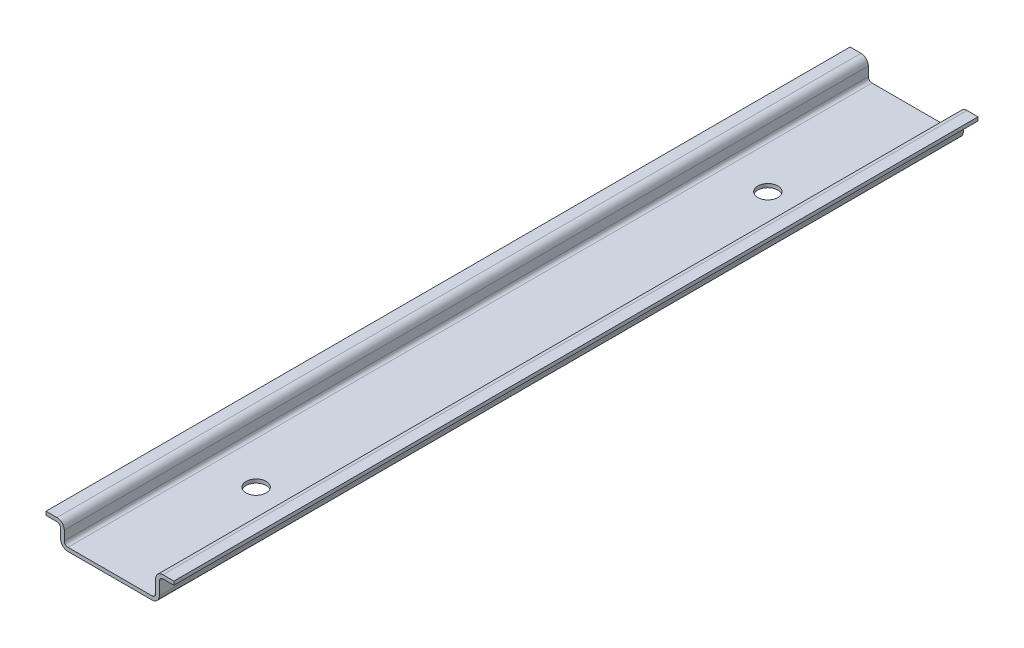
ISO-10303-21;
HEADER;
FILE_DESCRIPTION(('STEP AP214'),'2;1');
FILE_NAME('part.step','',(''),(''),'','','');
FILE_SCHEMA(('AUTOMOTIVE_DESIGN { 1 0 10303 214 1 1 1 1 }'));
ENDSEC;
DATA;
#1=APPLICATION_CONTEXT('core data for automotive mechanical design processes');
#2=APPLICATION_PROTOCOL_DEFINITION('international standard','automotive_design',2000,#1);
#3=PRODUCT_CONTEXT('',#1,'mechanical');
#4=PRODUCT('Part','Part','',(#3));
#5=PRODUCT_RELATED_PRODUCT_CATEGORY('part','',(#4));
#6=PRODUCT_DEFINITION_FORMATION('','',#4);
#7=PRODUCT_DEFINITION_CONTEXT('part definition',#1,'design');
#8=PRODUCT_DEFINITION('design','',#6,#7);
#9=PRODUCT_DEFINITION_SHAPE('','',#8);
#10=(LENGTH_UNIT() NAMED_UNIT(*) SI_UNIT(.MILLI.,.METRE.));
#11=(NAMED_UNIT(*) PLANE_ANGLE_UNIT() SI_UNIT($,.RADIAN.));
#12=(NAMED_UNIT(*) SI_UNIT($,.STERADIAN.) SOLID_ANGLE_UNIT());
#13=UNCERTAINTY_MEASURE_WITH_UNIT(LENGTH_MEASURE(1.E-05),#10,'distance_accuracy_value','');
#14=(GEOMETRIC_REPRESENTATION_CONTEXT(3) GLOBAL_UNCERTAINTY_ASSIGNED_CONTEXT((#13)) GLOBAL_UNIT_ASSIGNED_CONTEXT((#10,
#11,#12)) REPRESENTATION_CONTEXT('',''));
#15=CARTESIAN_POINT('',(0.,0.,0.));
#16=DIRECTION('',(0.,0.,1.));
#17=DIRECTION('',(1.,0.,0.));
#18=AXIS2_PLACEMENT_3D('',#15,#16,#17);
#19=CARTESIAN_POINT('',(-4.,5.54454071771809,220.));
#20=DIRECTION('',(1.,0.,0.));
#21=DIRECTION('',(0.,0.,-1.));
#22=AXIS2_PLACEMENT_3D('',#19,#20,#21);
#23=PLANE('',#22);
#24=DIRECTION('',(0.,-1.,0.));
#25=VECTOR('',#24,1.);
#26=CARTESIAN_POINT('',(-4.,5.54454071771809,0.));
#27=LINE('',#26,#25);
#28=CARTESIAN_POINT('',(-4.,6.54454071771809,0.));
#29=VERTEX_POINT('',#28);
#30=CARTESIAN_POINT('',(-4.,5.54454071771809,0.));
#31=VERTEX_POINT('',#30);
#32=EDGE_CURVE('E201',#29,#31,#27,.T.);
#33=ORIENTED_EDGE('',*,*,#32,.T.);
#34=DIRECTION('',(0.,0.,-1.));
#35=VECTOR('',#34,1.);
#36=CARTESIAN_POINT('',(-4.,5.54454071771809,220.));
#37=LINE('',#36,#35);
#38=CARTESIAN_POINT('',(-4.,5.54454071771809,220.));
#39=VERTEX_POINT('',#38);
#40=EDGE_CURVE('E11',#39,#31,#37,.T.);
#41=ORIENTED_EDGE('',*,*,#40,.F.);
#42=DIRECTION('',(0.,-1.,0.));
#43=VECTOR('',#42,1.);
#44=CARTESIAN_POINT('',(-4.,5.54454071771809,220.));
#45=LINE('',#44,#43);
#46=CARTESIAN_POINT('',(-4.,6.54454071771809,220.));
#47=VERTEX_POINT('',#46);
#48=EDGE_CURVE('E240',#47,#39,#45,.T.);
#49=ORIENTED_EDGE('',*,*,#48,.F.);
#50=DIRECTION('',(0.,0.,-1.));
#51=VECTOR('',#50,1.);
#52=CARTESIAN_POINT('',(-4.,6.54454071771809,220.));
#53=LINE('',#52,#51);
#54=EDGE_CURVE('E197',#47,#29,#53,.T.);
#55=ORIENTED_EDGE('',*,*,#54,.T.);
#56=EDGE_LOOP('',(#33,#41,#49,#55));
#57=FACE_BOUND('',#56,.T.);
#58=ADVANCED_FACE('F33',(#57),#23,.F.);
#59=CARTESIAN_POINT('',(-1.00000000000001,5.54454071771809,220.));
#60=DIRECTION('',(0.,1.,0.));
#61=DIRECTION('',(-1.,0.,0.));
#62=AXIS2_PLACEMENT_3D('',#59,#60,#61);
#63=PLANE('',#62);
#64=DIRECTION('',(1.,0.,0.));
#65=VECTOR('',#64,1.);
#66=CARTESIAN_POINT('',(-1.00000000000001,5.54454071771809,0.));
#67=LINE('',#66,#65);
#68=CARTESIAN_POINT('',(-1.00000000000001,5.54454071771809,0.));
#69=VERTEX_POINT('',#68);
#70=EDGE_CURVE('E204',#31,#69,#67,.T.);
#71=ORIENTED_EDGE('',*,*,#70,.T.);
#72=DIRECTION('',(0.,0.,-1.));
#73=VECTOR('',#72,1.);
#74=CARTESIAN_POINT('',(-1.00000000000001,5.54454071771809,220.));
#75=LINE('',#74,#73);
#76=CARTESIAN_POINT('',(-1.00000000000001,5.54454071771809,220.));
#77=VERTEX_POINT('',#76);
#78=EDGE_CURVE('E41',#77,#69,#75,.T.);
#79=ORIENTED_EDGE('',*,*,#78,.F.);
#80=DIRECTION('',(1.,0.,0.));
#81=VECTOR('',#80,1.);
#82=CARTESIAN_POINT('',(-1.00000000000001,5.54454071771809,220.));
#83=LINE('',#82,#81);
#84=EDGE_CURVE('E128',#39,#77,#83,.T.);
#85=ORIENTED_EDGE('',*,*,#84,.F.);
#86=ORIENTED_EDGE('',*,*,#40,.T.);
#87=EDGE_LOOP('',(#71,#79,#85,#86));
#88=FACE_BOUND('',#87,.T.);
#89=ADVANCED_FACE('F358',(#88),#63,.F.);
#90=CARTESIAN_POINT('',(-1.,4.54454071771809,220.));
#91=DIRECTION('',(0.,0.,-1.));
#92=DIRECTION('',(-1.,0.,0.));
#93=AXIS2_PLACEMENT_3D('',#90,#91,#92);
#94=CYLINDRICAL_SURFACE('',#93,1.);
#95=CARTESIAN_POINT('',(-1.,4.54454071771809,0.));
#96=DIRECTION('',(0.,0.,-1.));
#97=DIRECTION('',(1.,0.,0.));
#98=AXIS2_PLACEMENT_3D('',#95,#96,#97);
#99=CIRCLE('',#98,1.);
#100=CARTESIAN_POINT('',(0.,4.54454071771808,0.));
#101=VERTEX_POINT('',#100);
#102=EDGE_CURVE('E207',#69,#101,#99,.T.);
#103=ORIENTED_EDGE('',*,*,#102,.T.);
#104=DIRECTION('',(0.,0.,-1.));
#105=VECTOR('',#104,1.);
#106=CARTESIAN_POINT('',(0.,4.54454071771808,220.));
#107=LINE('',#106,#105);
#108=CARTESIAN_POINT('',(0.,4.54454071771808,220.));
#109=VERTEX_POINT('',#108);
#110=EDGE_CURVE('E283',#109,#101,#107,.T.);
#111=ORIENTED_EDGE('',*,*,#110,.F.);
#112=CARTESIAN_POINT('',(-1.,4.54454071771809,220.));
#113=DIRECTION('',(0.,0.,-1.));
#114=DIRECTION('',(1.,0.,0.));
#115=AXIS2_PLACEMENT_3D('',#112,#113,#114);
#116=CIRCLE('',#115,1.);
#117=EDGE_CURVE('E291',#77,#109,#116,.T.);
#118=ORIENTED_EDGE('',*,*,#117,.F.);
#119=ORIENTED_EDGE('',*,*,#78,.T.);
#120=EDGE_LOOP('',(#103,#111,#118,#119));
#121=FACE_BOUND('',#120,.T.);
#122=ADVANCED_FACE('F289',(#121),#94,.F.);
#123=CARTESIAN_POINT('',(0.,2.00000000000001,220.));
#124=DIRECTION('',(1.,0.,0.));
#125=DIRECTION('',(0.,0.,-1.));
#126=AXIS2_PLACEMENT_3D('',#123,#124,#125);
#127=PLANE('',#126);
#128=DIRECTION('',(0.,-1.,0.));
#129=VECTOR('',#128,1.);
#130=CARTESIAN_POINT('',(0.,2.00000000000001,0.));
#131=LINE('',#130,#129);
#132=CARTESIAN_POINT('',(0.,2.00000000000001,0.));
#133=VERTEX_POINT('',#132);
#134=EDGE_CURVE('E209',#101,#133,#131,.T.);
#135=ORIENTED_EDGE('',*,*,#134,.T.);
#136=DIRECTION('',(0.,0.,-1.));
#137=VECTOR('',#136,1.);
#138=CARTESIAN_POINT('',(0.,2.00000000000001,220.));
#139=LINE('',#138,#137);
#140=CARTESIAN_POINT('',(0.,2.00000000000001,220.));
#141=VERTEX_POINT('',#140);
#142=EDGE_CURVE('E280',#141,#133,#139,.T.);
#143=ORIENTED_EDGE('',*,*,#142,.F.);
#144=DIRECTION('',(0.,-1.,0.));
#145=VECTOR('',#144,1.);
#146=CARTESIAN_POINT('',(0.,2.00000000000001,220.));
#147=LINE('',#146,#145);
#148=EDGE_CURVE('E309',#109,#141,#147,.T.);
#149=ORIENTED_EDGE('',*,*,#148,.F.);
#150=ORIENTED_EDGE('',*,*,#110,.T.);
#151=EDGE_LOOP('',(#135,#143,#149,#150));
#152=FACE_BOUND('',#151,.T.);
#153=ADVANCED_FACE('F300',(#152),#127,.F.);
#154=CARTESIAN_POINT('',(2.,2.,220.));
#155=DIRECTION('',(0.,0.,-1.));
#156=DIRECTION('',(-1.,0.,0.));
#157=AXIS2_PLACEMENT_3D('',#154,#155,#156);
#158=CYLINDRICAL_SURFACE('',#157,2.);
#159=CARTESIAN_POINT('',(2.,2.,0.));
#160=DIRECTION('',(0.,0.,1.));
#161=DIRECTION('',(-1.,0.,0.));
#162=AXIS2_PLACEMENT_3D('',#159,#160,#161);
#163=CIRCLE('',#162,2.);
#164=CARTESIAN_POINT('',(2.00000000000001,0.,0.));
#165=VERTEX_POINT('',#164);
#166=EDGE_CURVE('E211',#133,#165,#163,.T.);
#167=ORIENTED_EDGE('',*,*,#166,.T.);
#168=DIRECTION('',(0.,0.,-1.));
#169=VECTOR('',#168,1.);
#170=CARTESIAN_POINT('',(2.00000000000001,0.,220.));
#171=LINE('',#170,#169);
#172=CARTESIAN_POINT('',(2.00000000000001,0.,220.));
#173=VERTEX_POINT('',#172);
#174=EDGE_CURVE('E277',#173,#165,#171,.T.);
#175=ORIENTED_EDGE('',*,*,#174,.F.);
#176=CARTESIAN_POINT('',(2.,2.,220.));
#177=DIRECTION('',(0.,0.,1.));
#178=DIRECTION('',(-1.,0.,0.));
#179=AXIS2_PLACEMENT_3D('',#176,#177,#178);
#180=CIRCLE('',#179,2.);
#181=EDGE_CURVE('E306',#141,#173,#180,.T.);
#182=ORIENTED_EDGE('',*,*,#181,.F.);
#183=ORIENTED_EDGE('',*,*,#142,.T.);
#184=EDGE_LOOP('',(#167,#175,#182,#183));
#185=FACE_BOUND('',#184,.T.);
#186=ADVANCED_FACE('F304',(#185),#158,.T.);
#187=CARTESIAN_POINT('',(2.00000000000001,0.,220.));
#188=DIRECTION('',(0.,1.,0.));
#189=DIRECTION('',(0.,0.,1.));
#190=AXIS2_PLACEMENT_3D('',#187,#188,#189);
#191=PLANE('',#190);
#192=CARTESIAN_POINT('',(13.5,0.,180.));
#193=DIRECTION('',(0.,1.,0.));
#194=DIRECTION('',(0.,0.,1.));
#195=AXIS2_PLACEMENT_3D('',#192,#193,#194);
#196=CIRCLE('',#195,2.75);
#197=CARTESIAN_POINT('',(13.5,0.,182.75));
#198=VERTEX_POINT('',#197);
#199=EDGE_CURVE('E485',#198,#198,#196,.T.);
#200=ORIENTED_EDGE('',*,*,#199,.T.);
#201=EDGE_LOOP('',(#200));
#202=FACE_BOUND('',#201,.T.);
#203=CARTESIAN_POINT('',(13.5,0.,40.));
#204=DIRECTION('',(0.,1.,0.));
#205=DIRECTION('',(0.,0.,1.));
#206=AXIS2_PLACEMENT_3D('',#203,#204,#205);
#207=CIRCLE('',#206,2.75);
#208=CARTESIAN_POINT('',(13.5,0.,42.75));
#209=VERTEX_POINT('',#208);
#210=EDGE_CURVE('E205',#209,#209,#207,.T.);
#211=ORIENTED_EDGE('',*,*,#210,.T.);
#212=EDGE_LOOP('',(#211));
#213=FACE_BOUND('',#212,.T.);
#214=DIRECTION('',(1.,0.,0.));
#215=VECTOR('',#214,1.);
#216=CARTESIAN_POINT('',(2.00000000000001,0.,0.));
#217=LINE('',#216,#215);
#218=CARTESIAN_POINT('',(25.,0.,0.));
#219=VERTEX_POINT('',#218);
#220=EDGE_CURVE('E213',#165,#219,#217,.T.);
#221=ORIENTED_EDGE('',*,*,#220,.T.);
#222=DIRECTION('',(0.,0.,-1.));
#223=VECTOR('',#222,1.);
#224=CARTESIAN_POINT('',(25.,0.,220.));
#225=LINE('',#224,#223);
#226=CARTESIAN_POINT('',(25.,0.,220.));
#227=VERTEX_POINT('',#226);
#228=EDGE_CURVE('E274',#227,#219,#225,.T.);
#229=ORIENTED_EDGE('',*,*,#228,.F.);
#230=DIRECTION('',(1.,0.,0.));
#231=VECTOR('',#230,1.);
#232=CARTESIAN_POINT('',(2.00000000000001,0.,220.));
#233=LINE('',#232,#231);
#234=EDGE_CURVE('E308',#173,#227,#233,.T.);
#235=ORIENTED_EDGE('',*,*,#234,.F.);
#236=ORIENTED_EDGE('',*,*,#174,.T.);
#237=EDGE_LOOP('',(#221,#229,#235,#236));
#238=FACE_BOUND('',#237,.T.);
#239=ADVANCED_FACE('F371',(#202,#213,#238),#191,.F.);
#240=CARTESIAN_POINT('',(25.,2.,220.));
#241=DIRECTION('',(0.,0.,-1.));
#242=DIRECTION('',(-1.,0.,0.));
#243=AXIS2_PLACEMENT_3D('',#240,#241,#242);
#244=CYLINDRICAL_SURFACE('',#243,2.);
#245=CARTESIAN_POINT('',(25.,2.,0.));
#246=DIRECTION('',(0.,0.,1.));
#247=DIRECTION('',(1.,0.,0.));
#248=AXIS2_PLACEMENT_3D('',#245,#246,#247);
#249=CIRCLE('',#248,2.);
#250=CARTESIAN_POINT('',(27.,2.,0.));
#251=VERTEX_POINT('',#250);
#252=EDGE_CURVE('E215',#219,#251,#249,.T.);
#253=ORIENTED_EDGE('',*,*,#252,.T.);
#254=DIRECTION('',(0.,0.,-1.));
#255=VECTOR('',#254,1.);
#256=CARTESIAN_POINT('',(27.,2.,220.));
#257=LINE('',#256,#255);
#258=CARTESIAN_POINT('',(27.,2.,220.));
#259=VERTEX_POINT('',#258);
#260=EDGE_CURVE('E271',#259,#251,#257,.T.);
#261=ORIENTED_EDGE('',*,*,#260,.F.);
#262=CARTESIAN_POINT('',(25.,2.,220.));
#263=DIRECTION('',(0.,0.,1.));
#264=DIRECTION('',(1.,0.,0.));
#265=AXIS2_PLACEMENT_3D('',#262,#263,#264);
#266=CIRCLE('',#265,2.);
#267=EDGE_CURVE('E311',#227,#259,#266,.T.);
#268=ORIENTED_EDGE('',*,*,#267,.F.);
#269=ORIENTED_EDGE('',*,*,#228,.T.);
#270=EDGE_LOOP('',(#253,#261,#268,#269));
#271=FACE_BOUND('',#270,.T.);
#272=ADVANCED_FACE('F374',(#271),#244,.T.);
#273=CARTESIAN_POINT('',(27.,2.00000000000001,220.));
#274=DIRECTION('',(-1.,0.,0.));
#275=DIRECTION('',(0.,0.,1.));
#276=AXIS2_PLACEMENT_3D('',#273,#274,#275);
#277=PLANE('',#276);
#278=DIRECTION('',(0.,1.,0.));
#279=VECTOR('',#278,1.);
#280=CARTESIAN_POINT('',(27.,2.00000000000001,0.));
#281=LINE('',#280,#279);
#282=CARTESIAN_POINT('',(27.,5.49999999999999,0.));
#283=VERTEX_POINT('',#282);
#284=EDGE_CURVE('E217',#251,#283,#281,.T.);
#285=ORIENTED_EDGE('',*,*,#284,.T.);
#286=DIRECTION('',(0.,0.,-1.));
#287=VECTOR('',#286,1.);
#288=CARTESIAN_POINT('',(27.,5.49999999999999,220.));
#289=LINE('',#288,#287);
#290=CARTESIAN_POINT('',(27.,5.49999999999999,220.));
#291=VERTEX_POINT('',#290);
#292=EDGE_CURVE('E268',#291,#283,#289,.T.);
#293=ORIENTED_EDGE('',*,*,#292,.F.);
#294=DIRECTION('',(0.,1.,0.));
#295=VECTOR('',#294,1.);
#296=CARTESIAN_POINT('',(27.,2.00000000000001,220.));
#297=LINE('',#296,#295);
#298=EDGE_CURVE('E317',#259,#291,#297,.T.);
#299=ORIENTED_EDGE('',*,*,#298,.F.);
#300=ORIENTED_EDGE('',*,*,#260,.T.);
#301=EDGE_LOOP('',(#285,#293,#299,#300));
#302=FACE_BOUND('',#301,.T.);
#303=ADVANCED_FACE('F378',(#302),#277,.F.);
#304=CARTESIAN_POINT('',(28.,5.5,220.));
#305=DIRECTION('',(0.,0.,-1.));
#306=DIRECTION('',(-1.,0.,0.));
#307=AXIS2_PLACEMENT_3D('',#304,#305,#306);
#308=CYLINDRICAL_SURFACE('',#307,1.);
#309=CARTESIAN_POINT('',(28.,5.5,0.));
#310=DIRECTION('',(0.,0.,-1.));
#311=DIRECTION('',(-1.,0.,0.));
#312=AXIS2_PLACEMENT_3D('',#309,#310,#311);
#313=CIRCLE('',#312,1.);
#314=CARTESIAN_POINT('',(28.,6.5,0.));
#315=VERTEX_POINT('',#314);
#316=EDGE_CURVE('E219',#283,#315,#313,.T.);
#317=ORIENTED_EDGE('',*,*,#316,.T.);
#318=DIRECTION('',(0.,0.,-1.));
#319=VECTOR('',#318,1.);
#320=CARTESIAN_POINT('',(28.,6.5,220.));
#321=LINE('',#320,#319);
#322=CARTESIAN_POINT('',(28.,6.5,220.));
#323=VERTEX_POINT('',#322);
#324=EDGE_CURVE('E265',#323,#315,#321,.T.);
#325=ORIENTED_EDGE('',*,*,#324,.F.);
#326=CARTESIAN_POINT('',(28.,5.5,220.));
#327=DIRECTION('',(0.,0.,-1.));
#328=DIRECTION('',(-1.,0.,0.));
#329=AXIS2_PLACEMENT_3D('',#326,#327,#328);
#330=CIRCLE('',#329,1.);
#331=EDGE_CURVE('E319',#291,#323,#330,.T.);
#332=ORIENTED_EDGE('',*,*,#331,.F.);
#333=ORIENTED_EDGE('',*,*,#292,.T.);
#334=EDGE_LOOP('',(#317,#325,#332,#333));
#335=FACE_BOUND('',#334,.T.);
#336=ADVANCED_FACE('F382',(#335),#308,.F.);
#337=CARTESIAN_POINT('',(28.,6.5,220.));
#338=DIRECTION('',(0.,1.,0.));
#339=DIRECTION('',(-1.,0.,0.));
#340=AXIS2_PLACEMENT_3D('',#337,#338,#339);
#341=PLANE('',#340);
#342=DIRECTION('',(1.,0.,0.));
#343=VECTOR('',#342,1.);
#344=CARTESIAN_POINT('',(28.,6.5,0.));
#345=LINE('',#344,#343);
#346=CARTESIAN_POINT('',(31.,6.5,0.));
#347=VERTEX_POINT('',#346);
#348=EDGE_CURVE('E221',#315,#347,#345,.T.);
#349=ORIENTED_EDGE('',*,*,#348,.T.);
#350=DIRECTION('',(0.,0.,-1.));
#351=VECTOR('',#350,1.);
#352=CARTESIAN_POINT('',(31.,6.5,220.));
#353=LINE('',#352,#351);
#354=CARTESIAN_POINT('',(31.,6.5,220.));
#355=VERTEX_POINT('',#354);
#356=EDGE_CURVE('E262',#355,#347,#353,.T.);
#357=ORIENTED_EDGE('',*,*,#356,.F.);
#358=DIRECTION('',(1.,0.,0.));
#359=VECTOR('',#358,1.);
#360=CARTESIAN_POINT('',(28.,6.5,220.));
#361=LINE('',#360,#359);
#362=EDGE_CURVE('E321',#323,#355,#361,.T.);
#363=ORIENTED_EDGE('',*,*,#362,.F.);
#364=ORIENTED_EDGE('',*,*,#324,.T.);
#365=EDGE_LOOP('',(#349,#357,#363,#364));
#366=FACE_BOUND('',#365,.T.);
#367=ADVANCED_FACE('F386',(#366),#341,.F.);
#368=CARTESIAN_POINT('',(31.,6.5,220.));
#369=DIRECTION('',(-1.,0.,0.));
#370=DIRECTION('',(0.,0.,1.));
#371=AXIS2_PLACEMENT_3D('',#368,#369,#370);
#372=PLANE('',#371);
#373=DIRECTION('',(0.,1.,0.));
#374=VECTOR('',#373,1.);
#375=CARTESIAN_POINT('',(31.,6.5,0.));
#376=LINE('',#375,#374);
#377=CARTESIAN_POINT('',(31.,7.5,0.));
#378=VERTEX_POINT('',#377);
#379=EDGE_CURVE('E223',#347,#378,#376,.T.);
#380=ORIENTED_EDGE('',*,*,#379,.T.);
#381=DIRECTION('',(0.,0.,-1.));
#382=VECTOR('',#381,1.);
#383=CARTESIAN_POINT('',(31.,7.5,220.));
#384=LINE('',#383,#382);
#385=CARTESIAN_POINT('',(31.,7.5,220.));
#386=VERTEX_POINT('',#385);
#387=EDGE_CURVE('E259',#386,#378,#384,.T.);
#388=ORIENTED_EDGE('',*,*,#387,.F.);
#389=DIRECTION('',(0.,1.,0.));
#390=VECTOR('',#389,1.);
#391=CARTESIAN_POINT('',(31.,6.5,220.));
#392=LINE('',#391,#390);
#393=EDGE_CURVE('E323',#355,#386,#392,.T.);
#394=ORIENTED_EDGE('',*,*,#393,.F.);
#395=ORIENTED_EDGE('',*,*,#356,.T.);
#396=EDGE_LOOP('',(#380,#388,#394,#395));
#397=FACE_BOUND('',#396,.T.);
#398=ADVANCED_FACE('F390',(#397),#372,.F.);
#399=CARTESIAN_POINT('',(28.,7.5,220.));
#400=DIRECTION('',(0.,-1.,0.));
#401=DIRECTION('',(0.,0.,-1.));
#402=AXIS2_PLACEMENT_3D('',#399,#400,#401);
#403=PLANE('',#402);
#404=DIRECTION('',(-1.,0.,0.));
#405=VECTOR('',#404,1.);
#406=CARTESIAN_POINT('',(28.,7.5,0.));
#407=LINE('',#406,#405);
#408=CARTESIAN_POINT('',(28.,7.5,0.));
#409=VERTEX_POINT('',#408);
#410=EDGE_CURVE('E225',#378,#409,#407,.T.);
#411=ORIENTED_EDGE('',*,*,#410,.T.);
#412=DIRECTION('',(0.,0.,-1.));
#413=VECTOR('',#412,1.);
#414=CARTESIAN_POINT('',(28.,7.5,220.));
#415=LINE('',#414,#413);
#416=CARTESIAN_POINT('',(28.,7.5,220.));
#417=VERTEX_POINT('',#416);
#418=EDGE_CURVE('E256',#417,#409,#415,.T.);
#419=ORIENTED_EDGE('',*,*,#418,.F.);
#420=DIRECTION('',(-1.,0.,0.));
#421=VECTOR('',#420,1.);
#422=CARTESIAN_POINT('',(28.,7.5,220.));
#423=LINE('',#422,#421);
#424=EDGE_CURVE('E325',#386,#417,#423,.T.);
#425=ORIENTED_EDGE('',*,*,#424,.F.);
#426=ORIENTED_EDGE('',*,*,#387,.T.);
#427=EDGE_LOOP('',(#411,#419,#425,#426));
#428=FACE_BOUND('',#427,.T.);
#429=ADVANCED_FACE('F394',(#428),#403,.F.);
#430=CARTESIAN_POINT('',(28.,5.5,220.));
#431=DIRECTION('',(0.,0.,-1.));
#432=DIRECTION('',(-1.,0.,0.));
#433=AXIS2_PLACEMENT_3D('',#430,#431,#432);
#434=CYLINDRICAL_SURFACE('',#433,2.);
#435=CARTESIAN_POINT('',(28.,5.5,0.));
#436=DIRECTION('',(0.,0.,1.));
#437=DIRECTION('',(-1.,0.,0.));
#438=AXIS2_PLACEMENT_3D('',#435,#436,#437);
#439=CIRCLE('',#438,2.);
#440=CARTESIAN_POINT('',(26.,5.49999999999999,0.));
#441=VERTEX_POINT('',#440);
#442=EDGE_CURVE('E227',#409,#441,#439,.T.);
#443=ORIENTED_EDGE('',*,*,#442,.T.);
#444=DIRECTION('',(0.,0.,-1.));
#445=VECTOR('',#444,1.);
#446=CARTESIAN_POINT('',(26.,5.49999999999999,220.));
#447=LINE('',#446,#445);
#448=CARTESIAN_POINT('',(26.,5.49999999999999,220.));
#449=VERTEX_POINT('',#448);
#450=EDGE_CURVE('E253',#449,#441,#447,.T.);
#451=ORIENTED_EDGE('',*,*,#450,.F.);
#452=CARTESIAN_POINT('',(28.,5.5,220.));
#453=DIRECTION('',(0.,0.,1.));
#454=DIRECTION('',(-1.,0.,0.));
#455=AXIS2_PLACEMENT_3D('',#452,#453,#454);
#456=CIRCLE('',#455,2.);
#457=EDGE_CURVE('E327',#417,#449,#456,.T.);
#458=ORIENTED_EDGE('',*,*,#457,.F.);
#459=ORIENTED_EDGE('',*,*,#418,.T.);
#460=EDGE_LOOP('',(#443,#451,#458,#459));
#461=FACE_BOUND('',#460,.T.);
#462=ADVANCED_FACE('F398',(#461),#434,.T.);
#463=CARTESIAN_POINT('',(26.,2.00000000000001,220.));
#464=DIRECTION('',(1.,0.,0.));
#465=DIRECTION('',(0.,0.,-1.));
#466=AXIS2_PLACEMENT_3D('',#463,#464,#465);
#467=PLANE('',#466);
#468=DIRECTION('',(0.,-1.,0.));
#469=VECTOR('',#468,1.);
#470=CARTESIAN_POINT('',(26.,2.00000000000001,0.));
#471=LINE('',#470,#469);
#472=CARTESIAN_POINT('',(26.,2.00000000000001,0.));
#473=VERTEX_POINT('',#472);
#474=EDGE_CURVE('E229',#441,#473,#471,.T.);
#475=ORIENTED_EDGE('',*,*,#474,.T.);
#476=DIRECTION('',(0.,0.,-1.));
#477=VECTOR('',#476,1.);
#478=CARTESIAN_POINT('',(26.,2.00000000000001,220.));
#479=LINE('',#478,#477);
#480=CARTESIAN_POINT('',(26.,2.00000000000001,220.));
#481=VERTEX_POINT('',#480);
#482=EDGE_CURVE('E250',#481,#473,#479,.T.);
#483=ORIENTED_EDGE('',*,*,#482,.F.);
#484=DIRECTION('',(0.,-1.,0.));
#485=VECTOR('',#484,1.);
#486=CARTESIAN_POINT('',(26.,2.00000000000001,220.));
#487=LINE('',#486,#485);
#488=EDGE_CURVE('E329',#449,#481,#487,.T.);
#489=ORIENTED_EDGE('',*,*,#488,.F.);
#490=ORIENTED_EDGE('',*,*,#450,.T.);
#491=EDGE_LOOP('',(#475,#483,#489,#490));
#492=FACE_BOUND('',#491,.T.);
#493=ADVANCED_FACE('F402',(#492),#467,.F.);
#494=CARTESIAN_POINT('',(25.,2.,220.));
#495=DIRECTION('',(0.,0.,-1.));
#496=DIRECTION('',(-1.,0.,0.));
#497=AXIS2_PLACEMENT_3D('',#494,#495,#496);
#498=CYLINDRICAL_SURFACE('',#497,1.);
#499=CARTESIAN_POINT('',(25.,2.,0.));
#500=DIRECTION('',(0.,0.,-1.));
#501=DIRECTION('',(1.,0.,0.));
#502=AXIS2_PLACEMENT_3D('',#499,#500,#501);
#503=CIRCLE('',#502,1.);
#504=CARTESIAN_POINT('',(25.,1.,0.));
#505=VERTEX_POINT('',#504);
#506=EDGE_CURVE('E231',#473,#505,#503,.T.);
#507=ORIENTED_EDGE('',*,*,#506,.T.);
#508=DIRECTION('',(0.,0.,-1.));
#509=VECTOR('',#508,1.);
#510=CARTESIAN_POINT('',(25.,1.,220.));
#511=LINE('',#510,#509);
#512=CARTESIAN_POINT('',(25.,1.,220.));
#513=VERTEX_POINT('',#512);
#514=EDGE_CURVE('E247',#513,#505,#511,.T.);
#515=ORIENTED_EDGE('',*,*,#514,.F.);
#516=CARTESIAN_POINT('',(25.,2.,220.));
#517=DIRECTION('',(0.,0.,-1.));
#518=DIRECTION('',(1.,0.,0.));
#519=AXIS2_PLACEMENT_3D('',#516,#517,#518);
#520=CIRCLE('',#519,1.);
#521=EDGE_CURVE('E331',#481,#513,#520,.T.);
#522=ORIENTED_EDGE('',*,*,#521,.F.);
#523=ORIENTED_EDGE('',*,*,#482,.T.);
#524=EDGE_LOOP('',(#507,#515,#522,#523));
#525=FACE_BOUND('',#524,.T.);
#526=ADVANCED_FACE('F406',(#525),#498,.F.);
#527=CARTESIAN_POINT('',(2.00000000000001,1.,220.));
#528=DIRECTION('',(0.,-1.,0.));
#529=DIRECTION('',(0.,0.,-1.));
#530=AXIS2_PLACEMENT_3D('',#527,#528,#529);
#531=PLANE('',#530);
#532=CARTESIAN_POINT('',(13.5,1.,180.));
#533=DIRECTION('',(0.,1.,0.));
#534=DIRECTION('',(0.,0.,1.));
#535=AXIS2_PLACEMENT_3D('',#532,#533,#534);
#536=CIRCLE('',#535,2.75);
#537=CARTESIAN_POINT('',(13.5,1.,182.75));
#538=VERTEX_POINT('',#537);
#539=EDGE_CURVE('E488',#538,#538,#536,.T.);
#540=ORIENTED_EDGE('',*,*,#539,.F.);
#541=EDGE_LOOP('',(#540));
#542=FACE_BOUND('',#541,.T.);
#543=CARTESIAN_POINT('',(13.5,1.,40.));
#544=DIRECTION('',(0.,1.,0.));
#545=DIRECTION('',(0.,0.,1.));
#546=AXIS2_PLACEMENT_3D('',#543,#544,#545);
#547=CIRCLE('',#546,2.75);
#548=CARTESIAN_POINT('',(13.5,1.,42.75));
#549=VERTEX_POINT('',#548);
#550=EDGE_CURVE('E490',#549,#549,#547,.T.);
#551=ORIENTED_EDGE('',*,*,#550,.F.);
#552=EDGE_LOOP('',(#551));
#553=FACE_BOUND('',#552,.T.);
#554=DIRECTION('',(-1.,0.,0.));
#555=VECTOR('',#554,1.);
#556=CARTESIAN_POINT('',(2.00000000000001,1.,0.));
#557=LINE('',#556,#555);
#558=CARTESIAN_POINT('',(2.00000000000001,1.,0.));
#559=VERTEX_POINT('',#558);
#560=EDGE_CURVE('E233',#505,#559,#557,.T.);
#561=ORIENTED_EDGE('',*,*,#560,.T.);
#562=DIRECTION('',(0.,0.,-1.));
#563=VECTOR('',#562,1.);
#564=CARTESIAN_POINT('',(2.00000000000001,1.,220.));
#565=LINE('',#564,#563);
#566=CARTESIAN_POINT('',(2.00000000000001,1.,220.));
#567=VERTEX_POINT('',#566);
#568=EDGE_CURVE('E244',#567,#559,#565,.T.);
#569=ORIENTED_EDGE('',*,*,#568,.F.);
#570=DIRECTION('',(-1.,0.,0.));
#571=VECTOR('',#570,1.);
#572=CARTESIAN_POINT('',(2.00000000000001,1.,220.));
#573=LINE('',#572,#571);
#574=EDGE_CURVE('E333',#513,#567,#573,.T.);
#575=ORIENTED_EDGE('',*,*,#574,.F.);
#576=ORIENTED_EDGE('',*,*,#514,.T.);
#577=EDGE_LOOP('',(#561,#569,#575,#576));
#578=FACE_BOUND('',#577,.T.);
#579=ADVANCED_FACE('F339',(#542,#553,#578),#531,.F.);
#580=CARTESIAN_POINT('',(2.,2.,220.));
#581=DIRECTION('',(0.,0.,-1.));
#582=DIRECTION('',(-1.,0.,0.));
#583=AXIS2_PLACEMENT_3D('',#580,#581,#582);
#584=CYLINDRICAL_SURFACE('',#583,1.);
#585=CARTESIAN_POINT('',(2.,2.,0.));
#586=DIRECTION('',(0.,0.,-1.));
#587=DIRECTION('',(1.,0.,0.));
#588=AXIS2_PLACEMENT_3D('',#585,#586,#587);
#589=CIRCLE('',#588,1.);
#590=CARTESIAN_POINT('',(1.,2.00000000000001,0.));
#591=VERTEX_POINT('',#590);
#592=EDGE_CURVE('E235',#559,#591,#589,.T.);
#593=ORIENTED_EDGE('',*,*,#592,.T.);
#594=DIRECTION('',(0.,0.,-1.));
#595=VECTOR('',#594,1.);
#596=CARTESIAN_POINT('',(1.,2.00000000000001,220.));
#597=LINE('',#596,#595);
#598=CARTESIAN_POINT('',(1.,2.00000000000001,220.));
#599=VERTEX_POINT('',#598);
#600=EDGE_CURVE('E192',#599,#591,#597,.T.);
#601=ORIENTED_EDGE('',*,*,#600,.F.);
#602=CARTESIAN_POINT('',(2.,2.,220.));
#603=DIRECTION('',(0.,0.,-1.));
#604=DIRECTION('',(1.,0.,0.));
#605=AXIS2_PLACEMENT_3D('',#602,#603,#604);
#606=CIRCLE('',#605,1.);
#607=EDGE_CURVE('E183',#567,#599,#606,.T.);
#608=ORIENTED_EDGE('',*,*,#607,.F.);
#609=ORIENTED_EDGE('',*,*,#568,.T.);
#610=EDGE_LOOP('',(#593,#601,#608,#609));
#611=FACE_BOUND('',#610,.T.);
#612=ADVANCED_FACE('F343',(#611),#584,.F.);
#613=CARTESIAN_POINT('',(1.,2.00000000000001,220.));
#614=DIRECTION('',(-1.,0.,0.));
#615=DIRECTION('',(0.,0.,1.));
#616=AXIS2_PLACEMENT_3D('',#613,#614,#615);
#617=PLANE('',#616);
#618=DIRECTION('',(0.,1.,0.));
#619=VECTOR('',#618,1.);
#620=CARTESIAN_POINT('',(1.,2.00000000000001,0.));
#621=LINE('',#620,#619);
#622=CARTESIAN_POINT('',(1.,4.54454071771807,0.));
#623=VERTEX_POINT('',#622);
#624=EDGE_CURVE('E191',#591,#623,#621,.T.);
#625=ORIENTED_EDGE('',*,*,#624,.T.);
#626=DIRECTION('',(0.,0.,-1.));
#627=VECTOR('',#626,1.);
#628=CARTESIAN_POINT('',(1.,4.54454071771807,220.));
#629=LINE('',#628,#627);
#630=CARTESIAN_POINT('',(1.,4.54454071771807,220.));
#631=VERTEX_POINT('',#630);
#632=EDGE_CURVE('E188',#631,#623,#629,.T.);
#633=ORIENTED_EDGE('',*,*,#632,.F.);
#634=DIRECTION('',(0.,1.,0.));
#635=VECTOR('',#634,1.);
#636=CARTESIAN_POINT('',(1.,2.00000000000001,220.));
#637=LINE('',#636,#635);
#638=EDGE_CURVE('E177',#599,#631,#637,.T.);
#639=ORIENTED_EDGE('',*,*,#638,.F.);
#640=ORIENTED_EDGE('',*,*,#600,.T.);
#641=EDGE_LOOP('',(#625,#633,#639,#640));
#642=FACE_BOUND('',#641,.T.);
#643=ADVANCED_FACE('F189',(#642),#617,.F.);
#644=CARTESIAN_POINT('',(-1.,4.54454071771809,220.));
#645=DIRECTION('',(0.,0.,-1.));
#646=DIRECTION('',(-1.,0.,0.));
#647=AXIS2_PLACEMENT_3D('',#644,#645,#646);
#648=CYLINDRICAL_SURFACE('',#647,2.);
#649=CARTESIAN_POINT('',(-1.,4.54454071771809,0.));
#650=DIRECTION('',(0.,0.,1.));
#651=DIRECTION('',(-1.,0.,0.));
#652=AXIS2_PLACEMENT_3D('',#649,#650,#651);
#653=CIRCLE('',#652,2.);
#654=CARTESIAN_POINT('',(-1.00000000000001,6.54454071771809,0.));
#655=VERTEX_POINT('',#654);
#656=EDGE_CURVE('E114',#623,#655,#653,.T.);
#657=ORIENTED_EDGE('',*,*,#656,.T.);
#658=DIRECTION('',(0.,0.,-1.));
#659=VECTOR('',#658,1.);
#660=CARTESIAN_POINT('',(-1.00000000000001,6.54454071771809,220.));
#661=LINE('',#660,#659);
#662=CARTESIAN_POINT('',(-1.00000000000001,6.54454071771809,220.));
#663=VERTEX_POINT('',#662);
#664=EDGE_CURVE('E193',#663,#655,#661,.T.);
#665=ORIENTED_EDGE('',*,*,#664,.F.);
#666=CARTESIAN_POINT('',(-1.,4.54454071771809,220.));
#667=DIRECTION('',(0.,0.,1.));
#668=DIRECTION('',(-1.,0.,0.));
#669=AXIS2_PLACEMENT_3D('',#666,#667,#668);
#670=CIRCLE('',#669,2.);
#671=EDGE_CURVE('E181',#631,#663,#670,.T.);
#672=ORIENTED_EDGE('',*,*,#671,.F.);
#673=ORIENTED_EDGE('',*,*,#632,.T.);
#674=EDGE_LOOP('',(#657,#665,#672,#673));
#675=FACE_BOUND('',#674,.T.);
#676=ADVANCED_FACE('F195',(#675),#648,.T.);
#677=CARTESIAN_POINT('',(-1.00000000000001,6.54454071771809,220.));
#678=DIRECTION('',(0.,-1.,0.));
#679=DIRECTION('',(1.,0.,0.));
#680=AXIS2_PLACEMENT_3D('',#677,#678,#679);
#681=PLANE('',#680);
#682=DIRECTION('',(-1.,0.,0.));
#683=VECTOR('',#682,1.);
#684=CARTESIAN_POINT('',(-1.00000000000001,6.54454071771809,0.));
#685=LINE('',#684,#683);
#686=EDGE_CURVE('E120',#655,#29,#685,.T.);
#687=ORIENTED_EDGE('',*,*,#686,.T.);
#688=ORIENTED_EDGE('',*,*,#54,.F.);
#689=DIRECTION('',(-1.,0.,0.));
#690=VECTOR('',#689,1.);
#691=CARTESIAN_POINT('',(-1.00000000000001,6.54454071771809,220.));
#692=LINE('',#691,#690);
#693=EDGE_CURVE('E49',#663,#47,#692,.T.);
#694=ORIENTED_EDGE('',*,*,#693,.F.);
#695=ORIENTED_EDGE('',*,*,#664,.T.);
#696=EDGE_LOOP('',(#687,#688,#694,#695));
#697=FACE_BOUND('',#696,.T.);
#698=ADVANCED_FACE('F347',(#697),#681,.F.);
#699=CARTESIAN_POINT('',(-1.,4.54454071771809,220.));
#700=DIRECTION('',(0.,0.,-1.));
#701=DIRECTION('',(-1.,0.,0.));
#702=AXIS2_PLACEMENT_3D('',#699,#700,#701);
#703=PLANE('',#702);
#704=ORIENTED_EDGE('',*,*,#48,.T.);
#705=ORIENTED_EDGE('',*,*,#84,.T.);
#706=ORIENTED_EDGE('',*,*,#117,.T.);
#707=ORIENTED_EDGE('',*,*,#148,.T.);
#708=ORIENTED_EDGE('',*,*,#181,.T.);
#709=ORIENTED_EDGE('',*,*,#234,.T.);
#710=ORIENTED_EDGE('',*,*,#267,.T.);
#711=ORIENTED_EDGE('',*,*,#298,.T.);
#712=ORIENTED_EDGE('',*,*,#331,.T.);
#713=ORIENTED_EDGE('',*,*,#362,.T.);
#714=ORIENTED_EDGE('',*,*,#393,.T.);
#715=ORIENTED_EDGE('',*,*,#424,.T.);
#716=ORIENTED_EDGE('',*,*,#457,.T.);
#717=ORIENTED_EDGE('',*,*,#488,.T.);
#718=ORIENTED_EDGE('',*,*,#521,.T.);
#719=ORIENTED_EDGE('',*,*,#574,.T.);
#720=ORIENTED_EDGE('',*,*,#607,.T.);
#721=ORIENTED_EDGE('',*,*,#638,.T.);
#722=ORIENTED_EDGE('',*,*,#671,.T.);
#723=ORIENTED_EDGE('',*,*,#693,.T.);
#724=EDGE_LOOP('',(#704,#705,#706,#707,#708,#709,#710,#711,#712,#713,#714,#715,#716,#717,#718,
#719,#720,#721,#722,#723));
#725=FACE_BOUND('',#724,.T.);
#726=ADVANCED_FACE('F179',(#725),#703,.F.);
#727=CARTESIAN_POINT('',(-1.,4.54454071771809,0.));
#728=DIRECTION('',(0.,0.,-1.));
#729=DIRECTION('',(-1.,0.,0.));
#730=AXIS2_PLACEMENT_3D('',#727,#728,#729);
#731=PLANE('',#730);
#732=ORIENTED_EDGE('',*,*,#32,.F.);
#733=ORIENTED_EDGE('',*,*,#686,.F.);
#734=ORIENTED_EDGE('',*,*,#656,.F.);
#735=ORIENTED_EDGE('',*,*,#624,.F.);
#736=ORIENTED_EDGE('',*,*,#592,.F.);
#737=ORIENTED_EDGE('',*,*,#560,.F.);
#738=ORIENTED_EDGE('',*,*,#506,.F.);
#739=ORIENTED_EDGE('',*,*,#474,.F.);
#740=ORIENTED_EDGE('',*,*,#442,.F.);
#741=ORIENTED_EDGE('',*,*,#410,.F.);
#742=ORIENTED_EDGE('',*,*,#379,.F.);
#743=ORIENTED_EDGE('',*,*,#348,.F.);
#744=ORIENTED_EDGE('',*,*,#316,.F.);
#745=ORIENTED_EDGE('',*,*,#284,.F.);
#746=ORIENTED_EDGE('',*,*,#252,.F.);
#747=ORIENTED_EDGE('',*,*,#220,.F.);
#748=ORIENTED_EDGE('',*,*,#166,.F.);
#749=ORIENTED_EDGE('',*,*,#134,.F.);
#750=ORIENTED_EDGE('',*,*,#102,.F.);
#751=ORIENTED_EDGE('',*,*,#70,.F.);
#752=EDGE_LOOP('',(#732,#733,#734,#735,#736,#737,#738,#739,#740,#741,#742,#743,#744,#745,#746,
#747,#748,#749,#750,#751));
#753=FACE_BOUND('',#752,.T.);
#754=ADVANCED_FACE('F295',(#753),#731,.T.);
#755=CARTESIAN_POINT('',(13.5,0.,40.));
#756=DIRECTION('',(0.,1.,0.));
#757=DIRECTION('',(0.,0.,1.));
#758=AXIS2_PLACEMENT_3D('',#755,#756,#757);
#759=CYLINDRICAL_SURFACE('',#758,2.75);
#760=ORIENTED_EDGE('',*,*,#210,.F.);
#761=EDGE_LOOP('',(#760));
#762=FACE_BOUND('',#761,.T.);
#763=ORIENTED_EDGE('',*,*,#550,.T.);
#764=EDGE_LOOP('',(#763));
#765=FACE_BOUND('',#764,.T.);
#766=ADVANCED_FACE('F444',(#762,#765),#759,.F.);
#767=CARTESIAN_POINT('',(13.5,0.,180.));
#768=DIRECTION('',(0.,1.,0.));
#769=DIRECTION('',(0.,0.,1.));
#770=AXIS2_PLACEMENT_3D('',#767,#768,#769);
#771=CYLINDRICAL_SURFACE('',#770,2.75);
#772=ORIENTED_EDGE('',*,*,#199,.F.);
#773=EDGE_LOOP('',(#772));
#774=FACE_BOUND('',#773,.T.);
#775=ORIENTED_EDGE('',*,*,#539,.T.);
#776=EDGE_LOOP('',(#775));
#777=FACE_BOUND('',#776,.T.);
#778=ADVANCED_FACE('F468',(#774,#777),#771,.F.);
#779=CLOSED_SHELL('',(#58,#89,#122,#153,#186,#239,#272,#303,#336,#367,#398,#429,#462,#493,#526,
#579,#612,#643,#676,#698,#726,#754,#766,#778));
#780=MANIFOLD_SOLID_BREP('B2',#779);
#781=ADVANCED_BREP_SHAPE_REPRESENTATION('',(#18,#780),#14);
#782=SHAPE_DEFINITION_REPRESENTATION(#9,#781);
ENDSEC;
END-ISO-10303-21;
